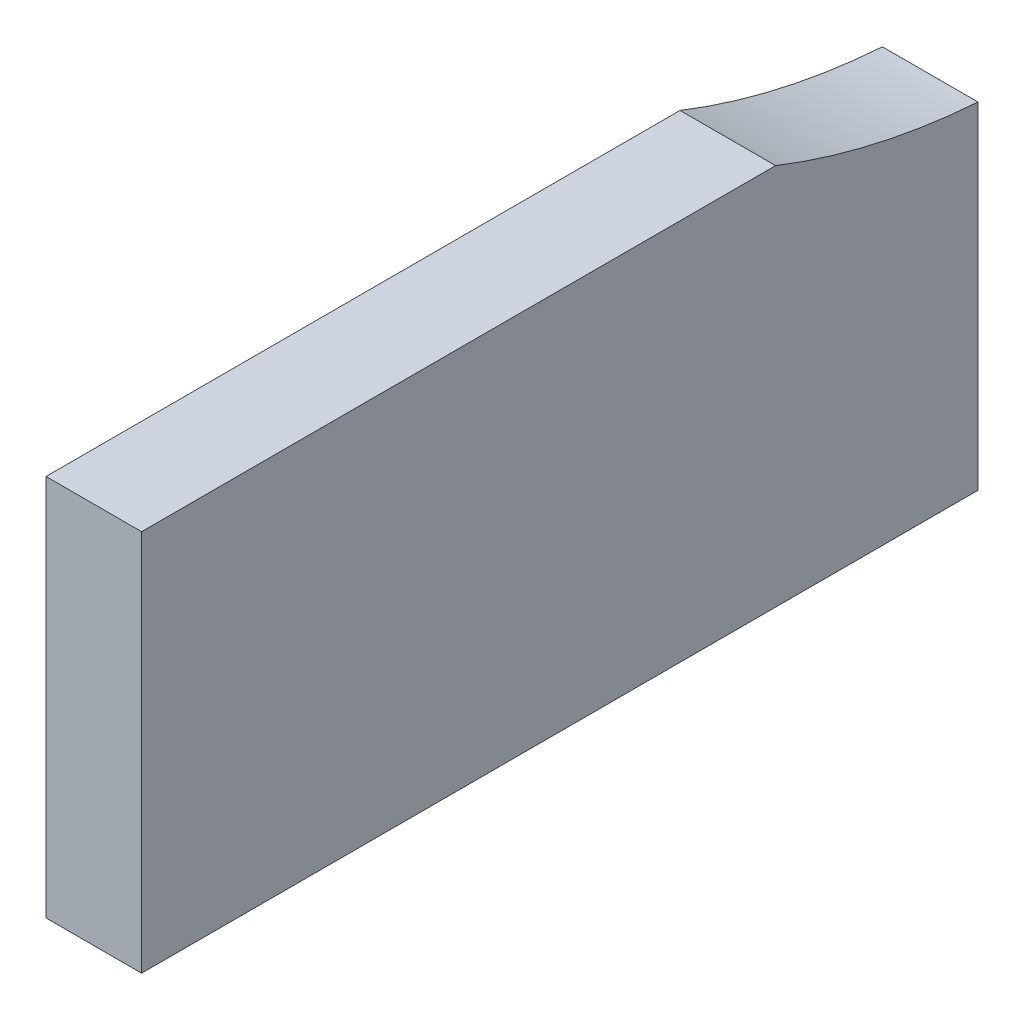
ISO-10303-21;
HEADER;
FILE_DESCRIPTION(('STEP AP214'),'2;1');
FILE_NAME('part.step','',(''),(''),'','','');
FILE_SCHEMA(('AUTOMOTIVE_DESIGN { 1 0 10303 214 1 1 1 1 }'));
ENDSEC;
DATA;
#1=APPLICATION_CONTEXT('core data for automotive mechanical design processes');
#2=APPLICATION_PROTOCOL_DEFINITION('international standard','automotive_design',2000,#1);
#3=PRODUCT_CONTEXT('',#1,'mechanical');
#4=PRODUCT('Part','Part','',(#3));
#5=PRODUCT_RELATED_PRODUCT_CATEGORY('part','',(#4));
#6=PRODUCT_DEFINITION_FORMATION('','',#4);
#7=PRODUCT_DEFINITION_CONTEXT('part definition',#1,'design');
#8=PRODUCT_DEFINITION('design','',#6,#7);
#9=PRODUCT_DEFINITION_SHAPE('','',#8);
#10=(LENGTH_UNIT() NAMED_UNIT(*) SI_UNIT(.MILLI.,.METRE.));
#11=(NAMED_UNIT(*) PLANE_ANGLE_UNIT() SI_UNIT($,.RADIAN.));
#12=(NAMED_UNIT(*) SI_UNIT($,.STERADIAN.) SOLID_ANGLE_UNIT());
#13=UNCERTAINTY_MEASURE_WITH_UNIT(LENGTH_MEASURE(1.E-05),#10,'distance_accuracy_value','');
#14=(GEOMETRIC_REPRESENTATION_CONTEXT(3) GLOBAL_UNCERTAINTY_ASSIGNED_CONTEXT((#13)) GLOBAL_UNIT_ASSIGNED_CONTEXT((#10,
#11,#12)) REPRESENTATION_CONTEXT('',''));
#15=CARTESIAN_POINT('',(0.,0.,0.));
#16=DIRECTION('',(0.,0.,1.));
#17=DIRECTION('',(1.,0.,0.));
#18=AXIS2_PLACEMENT_3D('',#15,#16,#17);
#19=CARTESIAN_POINT('',(0.,0.,88.5));
#20=DIRECTION('',(0.,0.,1.));
#21=DIRECTION('',(1.,0.,0.));
#22=AXIS2_PLACEMENT_3D('',#19,#20,#21);
#23=PLANE('',#22);
#24=DIRECTION('',(0.,-1.,0.));
#25=VECTOR('',#24,1.);
#26=CARTESIAN_POINT('',(-5.,20.,88.5));
#27=LINE('',#26,#25);
#28=CARTESIAN_POINT('',(-5.,20.,88.5));
#29=VERTEX_POINT('',#28);
#30=CARTESIAN_POINT('',(-5.,0.,88.5));
#31=VERTEX_POINT('',#30);
#32=EDGE_CURVE('E111',#29,#31,#27,.T.);
#33=ORIENTED_EDGE('',*,*,#32,.T.);
#34=DIRECTION('',(1.,0.,0.));
#35=VECTOR('',#34,1.);
#36=CARTESIAN_POINT('',(-5.,0.,88.5));
#37=LINE('',#36,#35);
#38=CARTESIAN_POINT('',(0.,0.,88.5));
#39=VERTEX_POINT('',#38);
#40=EDGE_CURVE('E97',#31,#39,#37,.T.);
#41=ORIENTED_EDGE('',*,*,#40,.T.);
#42=DIRECTION('',(0.,1.,0.));
#43=VECTOR('',#42,1.);
#44=CARTESIAN_POINT('',(0.,20.,88.5));
#45=LINE('',#44,#43);
#46=CARTESIAN_POINT('',(0.,20.,88.5));
#47=VERTEX_POINT('',#46);
#48=EDGE_CURVE('E108',#39,#47,#45,.T.);
#49=ORIENTED_EDGE('',*,*,#48,.T.);
#50=DIRECTION('',(-1.,0.,0.));
#51=VECTOR('',#50,1.);
#52=CARTESIAN_POINT('',(-5.,20.,88.5));
#53=LINE('',#52,#51);
#54=EDGE_CURVE('E56',#47,#29,#53,.T.);
#55=ORIENTED_EDGE('',*,*,#54,.T.);
#56=EDGE_LOOP('',(#33,#41,#49,#55));
#57=FACE_BOUND('',#56,.T.);
#58=ADVANCED_FACE('F34',(#57),#23,.T.);
#59=CARTESIAN_POINT('',(-5.,20.,88.5));
#60=DIRECTION('',(0.,-1.,0.));
#61=DIRECTION('',(0.,0.,-1.));
#62=AXIS2_PLACEMENT_3D('',#59,#60,#61);
#63=PLANE('',#62);
#64=DIRECTION('',(-1.,0.,0.));
#65=VECTOR('',#64,1.);
#66=CARTESIAN_POINT('',(35.,20.,55.3362523283025));
#67=LINE('',#66,#65);
#68=CARTESIAN_POINT('',(-5.,20.,55.3362523283024));
#69=VERTEX_POINT('',#68);
#70=CARTESIAN_POINT('',(0.,20.,55.3362523283024));
#71=VERTEX_POINT('',#70);
#72=EDGE_CURVE('E42',#69,#71,#67,.F.);
#73=ORIENTED_EDGE('',*,*,#72,.F.);
#74=DIRECTION('',(0.,0.,-1.));
#75=VECTOR('',#74,1.);
#76=CARTESIAN_POINT('',(-5.,20.,88.5));
#77=LINE('',#76,#75);
#78=EDGE_CURVE('E105',#29,#69,#77,.T.);
#79=ORIENTED_EDGE('',*,*,#78,.F.);
#80=ORIENTED_EDGE('',*,*,#54,.F.);
#81=DIRECTION('',(0.,0.,-1.));
#82=VECTOR('',#81,1.);
#83=CARTESIAN_POINT('',(0.,20.,88.5));
#84=LINE('',#83,#82);
#85=EDGE_CURVE('E100',#47,#71,#84,.T.);
#86=ORIENTED_EDGE('',*,*,#85,.T.);
#87=EDGE_LOOP('',(#73,#79,#80,#86));
#88=FACE_BOUND('',#87,.T.);
#89=ADVANCED_FACE('F126',(#88),#63,.F.);
#90=CARTESIAN_POINT('',(35.,53.,42.25));
#91=DIRECTION('',(-1.,0.,0.));
#92=DIRECTION('',(0.,-1.,0.));
#93=AXIS2_PLACEMENT_3D('',#90,#91,#92);
#94=CYLINDRICAL_SURFACE('',#93,35.5);
#95=DIRECTION('',(-1.,0.,0.));
#96=VECTOR('',#95,1.);
#97=CARTESIAN_POINT('',(35.,17.5881375807484,44.75));
#98=LINE('',#97,#96);
#99=CARTESIAN_POINT('',(-5.,17.5881375807484,44.75));
#100=VERTEX_POINT('',#99);
#101=CARTESIAN_POINT('',(0.,17.5881375807484,44.75));
#102=VERTEX_POINT('',#101);
#103=EDGE_CURVE('E11',#100,#102,#98,.F.);
#104=ORIENTED_EDGE('',*,*,#103,.F.);
#105=CARTESIAN_POINT('',(-5.,53.,42.25));
#106=DIRECTION('',(1.,0.,0.));
#107=DIRECTION('',(0.,1.,0.));
#108=AXIS2_PLACEMENT_3D('',#105,#106,#107);
#109=CIRCLE('',#108,35.5);
#110=EDGE_CURVE('E94',#100,#69,#109,.F.);
#111=ORIENTED_EDGE('',*,*,#110,.T.);
#112=ORIENTED_EDGE('',*,*,#72,.T.);
#113=CARTESIAN_POINT('',(0.,53.,42.25));
#114=DIRECTION('',(-1.,0.,0.));
#115=DIRECTION('',(0.,-1.,0.));
#116=AXIS2_PLACEMENT_3D('',#113,#114,#115);
#117=CIRCLE('',#116,35.5);
#118=EDGE_CURVE('E114',#71,#102,#117,.F.);
#119=ORIENTED_EDGE('',*,*,#118,.T.);
#120=EDGE_LOOP('',(#104,#111,#112,#119));
#121=FACE_BOUND('',#120,.T.);
#122=ADVANCED_FACE('F123',(#121),#94,.F.);
#123=CARTESIAN_POINT('',(-5.,0.,88.5));
#124=DIRECTION('',(0.,1.,0.));
#125=DIRECTION('',(0.,0.,1.));
#126=AXIS2_PLACEMENT_3D('',#123,#124,#125);
#127=PLANE('',#126);
#128=DIRECTION('',(0.,0.,-1.));
#129=VECTOR('',#128,1.);
#130=CARTESIAN_POINT('',(-5.,0.,88.5));
#131=LINE('',#130,#129);
#132=CARTESIAN_POINT('',(-5.,0.,44.75));
#133=VERTEX_POINT('',#132);
#134=EDGE_CURVE('E92',#31,#133,#131,.T.);
#135=ORIENTED_EDGE('',*,*,#134,.T.);
#136=DIRECTION('',(-1.,0.,0.));
#137=VECTOR('',#136,1.);
#138=CARTESIAN_POINT('',(8.,0.,44.75));
#139=LINE('',#138,#137);
#140=CARTESIAN_POINT('',(0.,0.,44.75));
#141=VERTEX_POINT('',#140);
#142=EDGE_CURVE('E79',#141,#133,#139,.T.);
#143=ORIENTED_EDGE('',*,*,#142,.F.);
#144=DIRECTION('',(0.,0.,-1.));
#145=VECTOR('',#144,1.);
#146=CARTESIAN_POINT('',(0.,0.,88.5));
#147=LINE('',#146,#145);
#148=EDGE_CURVE('E98',#39,#141,#147,.T.);
#149=ORIENTED_EDGE('',*,*,#148,.F.);
#150=ORIENTED_EDGE('',*,*,#40,.F.);
#151=EDGE_LOOP('',(#135,#143,#149,#150));
#152=FACE_BOUND('',#151,.T.);
#153=ADVANCED_FACE('F96',(#152),#127,.F.);
#154=CARTESIAN_POINT('',(0.,20.,88.5));
#155=DIRECTION('',(-1.,0.,0.));
#156=DIRECTION('',(0.,-1.,0.));
#157=AXIS2_PLACEMENT_3D('',#154,#155,#156);
#158=PLANE('',#157);
#159=ORIENTED_EDGE('',*,*,#148,.T.);
#160=DIRECTION('',(0.,1.,0.));
#161=VECTOR('',#160,1.);
#162=CARTESIAN_POINT('',(0.,20.,44.75));
#163=LINE('',#162,#161);
#164=EDGE_CURVE('E82',#141,#102,#163,.T.);
#165=ORIENTED_EDGE('',*,*,#164,.T.);
#166=ORIENTED_EDGE('',*,*,#118,.F.);
#167=ORIENTED_EDGE('',*,*,#85,.F.);
#168=ORIENTED_EDGE('',*,*,#48,.F.);
#169=EDGE_LOOP('',(#159,#165,#166,#167,#168));
#170=FACE_BOUND('',#169,.T.);
#171=ADVANCED_FACE('F119',(#170),#158,.F.);
#172=CARTESIAN_POINT('',(-5.,20.,88.5));
#173=DIRECTION('',(1.,0.,0.));
#174=DIRECTION('',(0.,1.,0.));
#175=AXIS2_PLACEMENT_3D('',#172,#173,#174);
#176=PLANE('',#175);
#177=ORIENTED_EDGE('',*,*,#110,.F.);
#178=DIRECTION('',(0.,1.,0.));
#179=VECTOR('',#178,1.);
#180=CARTESIAN_POINT('',(-5.,0.,44.75));
#181=LINE('',#180,#179);
#182=EDGE_CURVE('E48',#133,#100,#181,.T.);
#183=ORIENTED_EDGE('',*,*,#182,.F.);
#184=ORIENTED_EDGE('',*,*,#134,.F.);
#185=ORIENTED_EDGE('',*,*,#32,.F.);
#186=ORIENTED_EDGE('',*,*,#78,.T.);
#187=EDGE_LOOP('',(#177,#183,#184,#185,#186));
#188=FACE_BOUND('',#187,.T.);
#189=ADVANCED_FACE('F36',(#188),#176,.F.);
#190=CARTESIAN_POINT('',(8.,0.,44.75));
#191=DIRECTION('',(0.,0.,1.));
#192=DIRECTION('',(1.,0.,0.));
#193=AXIS2_PLACEMENT_3D('',#190,#191,#192);
#194=PLANE('',#193);
#195=ORIENTED_EDGE('',*,*,#142,.T.);
#196=ORIENTED_EDGE('',*,*,#182,.T.);
#197=ORIENTED_EDGE('',*,*,#103,.T.);
#198=ORIENTED_EDGE('',*,*,#164,.F.);
#199=EDGE_LOOP('',(#195,#196,#197,#198));
#200=FACE_BOUND('',#199,.T.);
#201=ADVANCED_FACE('F80',(#200),#194,.F.);
#202=CLOSED_SHELL('',(#58,#89,#122,#153,#171,#189,#201));
#203=MANIFOLD_SOLID_BREP('B2',#202);
#204=ADVANCED_BREP_SHAPE_REPRESENTATION('',(#18,#203),#14);
#205=SHAPE_DEFINITION_REPRESENTATION(#9,#204);
ENDSEC;
END-ISO-10303-21;
